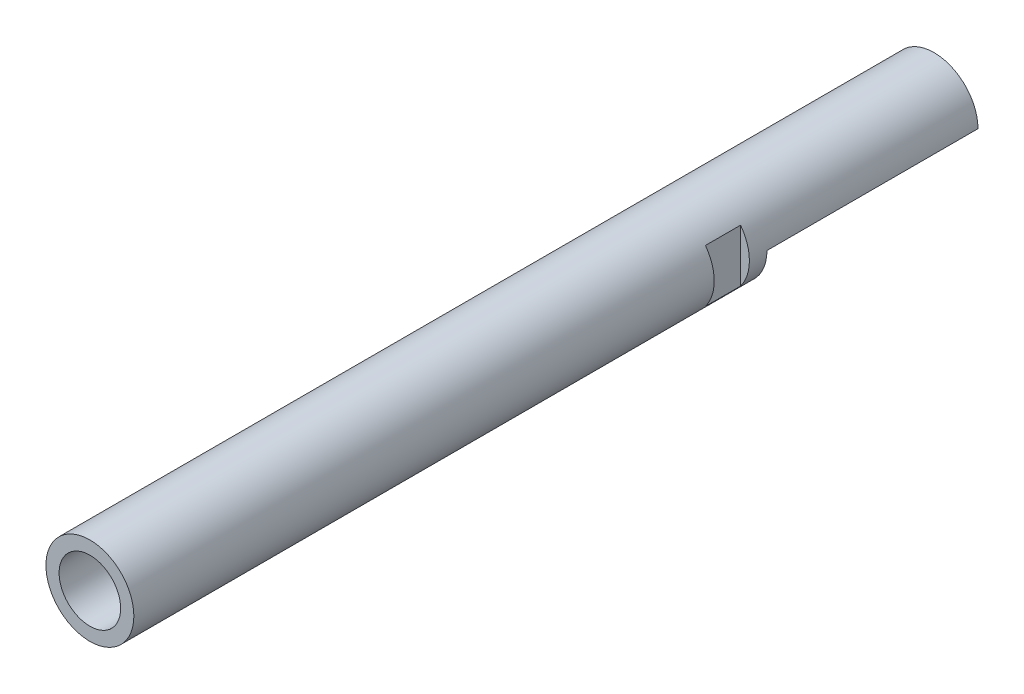
ISO-10303-21;
HEADER;
FILE_DESCRIPTION(('STEP AP214'),'2;1');
FILE_NAME('part.step','',(''),(''),'','','');
FILE_SCHEMA(('AUTOMOTIVE_DESIGN { 1 0 10303 214 1 1 1 1 }'));
ENDSEC;
DATA;
#1=APPLICATION_CONTEXT('core data for automotive mechanical design processes');
#2=APPLICATION_PROTOCOL_DEFINITION('international standard','automotive_design',2000,#1);
#3=PRODUCT_CONTEXT('',#1,'mechanical');
#4=PRODUCT('Part','Part','',(#3));
#5=PRODUCT_RELATED_PRODUCT_CATEGORY('part','',(#4));
#6=PRODUCT_DEFINITION_FORMATION('','',#4);
#7=PRODUCT_DEFINITION_CONTEXT('part definition',#1,'design');
#8=PRODUCT_DEFINITION('design','',#6,#7);
#9=PRODUCT_DEFINITION_SHAPE('','',#8);
#10=(LENGTH_UNIT() NAMED_UNIT(*) SI_UNIT(.MILLI.,.METRE.));
#11=(NAMED_UNIT(*) PLANE_ANGLE_UNIT() SI_UNIT($,.RADIAN.));
#12=(NAMED_UNIT(*) SI_UNIT($,.STERADIAN.) SOLID_ANGLE_UNIT());
#13=UNCERTAINTY_MEASURE_WITH_UNIT(LENGTH_MEASURE(1.E-05),#10,'distance_accuracy_value','');
#14=(GEOMETRIC_REPRESENTATION_CONTEXT(3) GLOBAL_UNCERTAINTY_ASSIGNED_CONTEXT((#13)) GLOBAL_UNIT_ASSIGNED_CONTEXT((#10,
#11,#12)) REPRESENTATION_CONTEXT('',''));
#15=CARTESIAN_POINT('',(0.,0.,0.));
#16=DIRECTION('',(0.,0.,1.));
#17=DIRECTION('',(1.,0.,0.));
#18=AXIS2_PLACEMENT_3D('',#15,#16,#17);
#19=CARTESIAN_POINT('',(0.,0.,304.8));
#20=DIRECTION('',(0.,0.,-1.));
#21=DIRECTION('',(-1.,0.,0.));
#22=AXIS2_PLACEMENT_3D('',#19,#20,#21);
#23=CYLINDRICAL_SURFACE('',#22,15.875);
#24=CARTESIAN_POINT('',(0.,0.,95.25));
#25=DIRECTION('',(0.,0.,-1.));
#26=DIRECTION('',(-1.,0.,0.));
#27=AXIS2_PLACEMENT_3D('',#24,#25,#26);
#28=CIRCLE('',#27,15.875);
#29=CARTESIAN_POINT('',(12.7,9.52499999999999,95.25));
#30=VERTEX_POINT('',#29);
#31=CARTESIAN_POINT('',(12.7,-9.525,95.25));
#32=VERTEX_POINT('',#31);
#33=EDGE_CURVE('E150',#30,#32,#28,.T.);
#34=ORIENTED_EDGE('',*,*,#33,.F.);
#35=DIRECTION('',(0.,0.,-1.));
#36=VECTOR('',#35,1.);
#37=CARTESIAN_POINT('',(12.7,9.52499999999999,95.25));
#38=LINE('',#37,#36);
#39=CARTESIAN_POINT('',(12.7,9.52499999999999,82.55));
#40=VERTEX_POINT('',#39);
#41=EDGE_CURVE('E155',#30,#40,#38,.T.);
#42=ORIENTED_EDGE('',*,*,#41,.T.);
#43=CARTESIAN_POINT('',(0.,0.,82.55));
#44=DIRECTION('',(0.,0.,-1.));
#45=DIRECTION('',(-1.,0.,0.));
#46=AXIS2_PLACEMENT_3D('',#43,#44,#45);
#47=CIRCLE('',#46,15.875);
#48=CARTESIAN_POINT('',(12.7,-9.525,82.55));
#49=VERTEX_POINT('',#48);
#50=EDGE_CURVE('E151',#40,#49,#47,.T.);
#51=ORIENTED_EDGE('',*,*,#50,.T.);
#52=DIRECTION('',(0.,0.,-1.));
#53=VECTOR('',#52,1.);
#54=CARTESIAN_POINT('',(12.7,-9.525,95.25));
#55=LINE('',#54,#53);
#56=EDGE_CURVE('E142',#32,#49,#55,.T.);
#57=ORIENTED_EDGE('',*,*,#56,.F.);
#58=EDGE_LOOP('',(#34,#42,#51,#57));
#59=FACE_BOUND('',#58,.T.);
#60=CARTESIAN_POINT('',(0.,0.,304.8));
#61=DIRECTION('',(0.,0.,1.));
#62=DIRECTION('',(1.,0.,0.));
#63=AXIS2_PLACEMENT_3D('',#60,#61,#62);
#64=CIRCLE('',#63,15.875);
#65=CARTESIAN_POINT('',(15.875,0.,304.8));
#66=VERTEX_POINT('',#65);
#67=EDGE_CURVE('E11',#66,#66,#64,.T.);
#68=ORIENTED_EDGE('',*,*,#67,.F.);
#69=EDGE_LOOP('',(#68));
#70=FACE_BOUND('',#69,.T.);
#71=CARTESIAN_POINT('',(0.,0.,76.2));
#72=DIRECTION('',(0.,0.,-1.));
#73=DIRECTION('',(-1.,0.,0.));
#74=AXIS2_PLACEMENT_3D('',#71,#72,#73);
#75=CIRCLE('',#74,15.875);
#76=CARTESIAN_POINT('',(15.875,0.,76.2));
#77=VERTEX_POINT('',#76);
#78=CARTESIAN_POINT('',(-15.875,0.,76.2));
#79=VERTEX_POINT('',#78);
#80=EDGE_CURVE('E167',#77,#79,#75,.T.);
#81=ORIENTED_EDGE('',*,*,#80,.F.);
#82=DIRECTION('',(0.,0.,-1.));
#83=VECTOR('',#82,1.);
#84=CARTESIAN_POINT('',(15.875,0.,76.2));
#85=LINE('',#84,#83);
#86=CARTESIAN_POINT('',(15.875,0.,0.));
#87=VERTEX_POINT('',#86);
#88=EDGE_CURVE('E178',#77,#87,#85,.T.);
#89=ORIENTED_EDGE('',*,*,#88,.T.);
#90=CARTESIAN_POINT('',(0.,0.,0.));
#91=DIRECTION('',(0.,0.,1.));
#92=DIRECTION('',(1.,0.,0.));
#93=AXIS2_PLACEMENT_3D('',#90,#91,#92);
#94=CIRCLE('',#93,15.875);
#95=CARTESIAN_POINT('',(-15.875,0.,0.));
#96=VERTEX_POINT('',#95);
#97=EDGE_CURVE('E48',#87,#96,#94,.T.);
#98=ORIENTED_EDGE('',*,*,#97,.T.);
#99=DIRECTION('',(0.,0.,-1.));
#100=VECTOR('',#99,1.);
#101=CARTESIAN_POINT('',(-15.875,0.,76.2));
#102=LINE('',#101,#100);
#103=EDGE_CURVE('E176',#79,#96,#102,.T.);
#104=ORIENTED_EDGE('',*,*,#103,.F.);
#105=EDGE_LOOP('',(#81,#89,#98,#104));
#106=FACE_BOUND('',#105,.T.);
#107=CARTESIAN_POINT('',(0.,0.,95.25));
#108=DIRECTION('',(0.,0.,-1.));
#109=DIRECTION('',(-1.,0.,0.));
#110=AXIS2_PLACEMENT_3D('',#107,#108,#109);
#111=CIRCLE('',#110,15.875);
#112=CARTESIAN_POINT('',(9.52499999999999,-12.7,95.25));
#113=VERTEX_POINT('',#112);
#114=CARTESIAN_POINT('',(-9.52499999999999,-12.7,95.25));
#115=VERTEX_POINT('',#114);
#116=EDGE_CURVE('E126',#113,#115,#111,.T.);
#117=ORIENTED_EDGE('',*,*,#116,.F.);
#118=DIRECTION('',(0.,0.,-1.));
#119=VECTOR('',#118,1.);
#120=CARTESIAN_POINT('',(9.52499999999999,-12.7,95.25));
#121=LINE('',#120,#119);
#122=CARTESIAN_POINT('',(9.52499999999999,-12.7,82.55));
#123=VERTEX_POINT('',#122);
#124=EDGE_CURVE('E116',#113,#123,#121,.T.);
#125=ORIENTED_EDGE('',*,*,#124,.T.);
#126=CARTESIAN_POINT('',(0.,0.,82.55));
#127=DIRECTION('',(0.,0.,-1.));
#128=DIRECTION('',(-1.,0.,0.));
#129=AXIS2_PLACEMENT_3D('',#126,#127,#128);
#130=CIRCLE('',#129,15.875);
#131=CARTESIAN_POINT('',(-9.52499999999999,-12.7,82.55));
#132=VERTEX_POINT('',#131);
#133=EDGE_CURVE('E132',#123,#132,#130,.T.);
#134=ORIENTED_EDGE('',*,*,#133,.T.);
#135=DIRECTION('',(0.,0.,-1.));
#136=VECTOR('',#135,1.);
#137=CARTESIAN_POINT('',(-9.52499999999999,-12.7,95.25));
#138=LINE('',#137,#136);
#139=EDGE_CURVE('E125',#115,#132,#138,.T.);
#140=ORIENTED_EDGE('',*,*,#139,.F.);
#141=EDGE_LOOP('',(#117,#125,#134,#140));
#142=FACE_BOUND('',#141,.T.);
#143=CARTESIAN_POINT('',(-3.175,-15.5542598666732,171.45));
#144=CARTESIAN_POINT('',(-3.17499347815399,-15.554263374096,171.626416892184));
#145=CARTESIAN_POINT('',(-3.16024632020511,-15.5572938875313,171.802915929083));
#146=CARTESIAN_POINT('',(-3.10169650037552,-15.5690706939298,172.150920953829));
#147=CARTESIAN_POINT('',(-3.05787058944881,-15.577821560347,172.322422831719));
#148=CARTESIAN_POINT('',(-2.94257660981768,-15.6000092406689,172.65534843815));
#149=CARTESIAN_POINT('',(-2.87113603493456,-15.6134413924691,172.816782005866));
#150=CARTESIAN_POINT('',(-2.70271591685384,-15.6434726335109,173.125367631913));
#151=CARTESIAN_POINT('',(-2.60573779905864,-15.6600715459824,173.272520486708));
#152=CARTESIAN_POINT('',(-2.38753356519964,-15.6948282652925,173.550456187236));
#153=CARTESIAN_POINT('',(-2.26601545752475,-15.7130031763326,173.681007691532));
#154=CARTESIAN_POINT('',(-2.00281155514263,-15.7487134956075,173.920015169113));
#155=CARTESIAN_POINT('',(-1.86112434790507,-15.7662488589439,174.02846959355));
#156=CARTESIAN_POINT('',(-1.56007230505949,-15.7988887862576,174.22110195597));
#157=CARTESIAN_POINT('',(-1.40056415235925,-15.8139708307692,174.305060056368));
#158=CARTESIAN_POINT('',(-1.06935317747957,-15.8398126460553,174.444897925128));
#159=CARTESIAN_POINT('',(-0.897651498510246,-15.8505728214008,174.500780321786));
#160=CARTESIAN_POINT('',(-0.549328255159211,-15.8664376818573,174.582160339742));
#161=CARTESIAN_POINT('',(-0.372801322007024,-15.871615014648,174.608048603788));
#162=CARTESIAN_POINT('',(-0.0178389547891655,-15.8759817475794,174.629924272087));
#163=CARTESIAN_POINT('',(0.160596293716114,-15.8751717247251,174.625914557625));
#164=CARTESIAN_POINT('',(0.511625852360906,-15.8677113070754,174.588404377816));
#165=CARTESIAN_POINT('',(0.684267155397654,-15.8611442481154,174.555324697492));
#166=CARTESIAN_POINT('',(1.02149791439247,-15.8430016248112,174.461281021943));
#167=CARTESIAN_POINT('',(1.18608704789715,-15.8314258600732,174.400315911041));
#168=CARTESIAN_POINT('',(1.50374179566283,-15.8044291486337,174.251842122532));
#169=CARTESIAN_POINT('',(1.65672825287515,-15.7889844295633,174.164168590242));
#170=CARTESIAN_POINT('',(1.94597352060474,-15.7559524057927,173.964888679774));
#171=CARTESIAN_POINT('',(2.08223040349189,-15.7383648546533,173.853279547729));
#172=CARTESIAN_POINT('',(2.33664579359473,-15.7026281185716,173.606988249806));
#173=CARTESIAN_POINT('',(2.45444745512127,-15.6844744875261,173.471937832134));
#174=CARTESIAN_POINT('',(2.66578871583636,-15.6499423982607,173.183815295219));
#175=CARTESIAN_POINT('',(2.75932785613561,-15.6335639736194,173.030742835196));
#176=CARTESIAN_POINT('',(2.91961193699597,-15.6044280072653,172.710408858966));
#177=CARTESIAN_POINT('',(2.98629910669422,-15.5916782896427,172.543117677744));
#178=CARTESIAN_POINT('',(3.09051433466756,-15.5713581232004,172.199391047176));
#179=CARTESIAN_POINT('',(3.12804619327484,-15.5637869993776,172.022956792809));
#180=CARTESIAN_POINT('',(3.17235206916446,-15.5548164667535,171.669186575853));
#181=CARTESIAN_POINT('',(3.17964140200086,-15.5533136690647,171.491917701565));
#182=CARTESIAN_POINT('',(3.16464196988659,-15.5563724206211,171.138696891341));
#183=CARTESIAN_POINT('',(3.14235488216375,-15.5609336259873,170.962744881298));
#184=CARTESIAN_POINT('',(3.06927951063544,-15.5755096317135,170.618884567072));
#185=CARTESIAN_POINT('',(3.01876657116477,-15.5854717187103,170.450915310861));
#186=CARTESIAN_POINT('',(2.89096778710454,-15.6096807869154,170.125824089084));
#187=CARTESIAN_POINT('',(2.81367973703483,-15.6239281210891,169.968703018367));
#188=CARTESIAN_POINT('',(2.63335815153451,-15.6553346392948,169.667513375908));
#189=CARTESIAN_POINT('',(2.53000217259522,-15.6725293567107,169.523641627995));
#190=CARTESIAN_POINT('',(2.30090844177534,-15.7077957314957,169.255096109397));
#191=CARTESIAN_POINT('',(2.17516838633388,-15.7258674789812,169.130424317059));
#192=CARTESIAN_POINT('',(1.90256246835578,-15.7611872313476,168.901863874586));
#193=CARTESIAN_POINT('',(1.75540193410156,-15.7784183322507,168.798323646486));
#194=CARTESIAN_POINT('',(1.44547557181534,-15.8098213022087,168.617436826239));
#195=CARTESIAN_POINT('',(1.28271039950137,-15.823993299728,168.54008913408));
#196=CARTESIAN_POINT('',(0.947111011616228,-15.8476090864389,168.414290832204));
#197=CARTESIAN_POINT('',(0.774340188292887,-15.8570796377776,168.365676354632));
#198=CARTESIAN_POINT('',(0.422876518608706,-15.8703402410208,168.298205288667));
#199=CARTESIAN_POINT('',(0.24418438815808,-15.8741309770952,168.279345116165));
#200=CARTESIAN_POINT('',(-0.110721438144017,-15.8755886594182,168.272056835443));
#201=CARTESIAN_POINT('',(-0.286924153549263,-15.8733610189412,168.283104884551));
#202=CARTESIAN_POINT('',(-0.634908024427208,-15.8632538830408,168.334162792989));
#203=CARTESIAN_POINT('',(-0.806689235468087,-15.8553744586832,168.374172288155));
#204=CARTESIAN_POINT('',(-1.1406274804406,-15.8348520730862,168.481784549891));
#205=CARTESIAN_POINT('',(-1.30280550728754,-15.8222199826118,168.549324375566));
#206=CARTESIAN_POINT('',(-1.61360237409078,-15.7935524274268,168.710013866226));
#207=CARTESIAN_POINT('',(-1.76222014131293,-15.7775166937919,168.803165554997));
#208=CARTESIAN_POINT('',(-2.04426785108629,-15.7434787732265,169.01420155392));
#209=CARTESIAN_POINT('',(-2.17741409866463,-15.7254490360183,169.132460618018));
#210=CARTESIAN_POINT('',(-2.42215231138326,-15.6896188273247,169.389584512314));
#211=CARTESIAN_POINT('',(-2.53373916418831,-15.6718184111493,169.528454216099));
#212=CARTESIAN_POINT('',(-2.7333327967537,-15.6382511318023,169.824651830492));
#213=CARTESIAN_POINT('',(-2.82107263641245,-15.6225082383864,169.98216245156));
#214=CARTESIAN_POINT('',(-2.96870135642028,-15.5951312787636,170.309961555101));
#215=CARTESIAN_POINT('',(-3.02861550096797,-15.5834934876682,170.480238282832));
#216=CARTESIAN_POINT('',(-3.10727451904805,-15.5679673761266,170.784083296031));
#217=CARTESIAN_POINT('',(-3.1326261278127,-15.5628589210387,170.915918706957));
#218=CARTESIAN_POINT('',(-3.16649105702208,-15.5560038910759,171.1818203057));
#219=CARTESIAN_POINT('',(-3.17500495796139,-15.5542572003013,171.315886416451));
#220=CARTESIAN_POINT('',(-3.175,-15.5542598666732,171.45));
#221=B_SPLINE_CURVE_WITH_KNOTS('',3,(#143,#144,#145,#146,#147,#148,#149,#150,#151,#152,#153,
#154,#155,#156,#157,#158,#159,#160,#161,#162,#163,#164,#165,#166,#167,#168,#169,#170,#171,#172,
#173,#174,#175,#176,#177,#178,#179,#180,#181,#182,#183,#184,#185,#186,#187,#188,#189,#190,#191,
#192,#193,#194,#195,#196,#197,#198,#199,#200,#201,#202,#203,#204,#205,#206,#207,#208,#209,#210,
#211,#212,#213,#214,#215,#216,#217,#218,#219,#220),.UNSPECIFIED.,.T.,.F.,(4,2,2,2,2,2,2,2,2,2,2,
2,2,2,2,2,2,2,2,2,2,2,2,2,2,2,2,2,2,2,2,2,2,2,2,2,2,2,4),(0.,0.528759622785412,1.05794250972765,
1.5865998809614,2.11522775093011,2.6505615184129,3.18593279612466,3.72597046388906,
4.26595756682828,4.79882990203781,5.33165088469089,5.85688407086482,6.38213827309158,
6.91070259405814,7.43932776069962,7.97716675970883,8.51501593039638,9.05401615573563,
9.59294611175879,10.1226543102958,10.6523324712774,11.1769316016204,11.7015739537522,
12.2330546478411,12.7645900686291,13.3042851050371,13.8439574730058,14.3805215811221,
14.9170210514592,15.4441848029163,15.9713419258945,16.4973005421456,17.0233007302762,
17.5577865768127,18.0923990097506,18.6327700299025,19.1726494591138,19.5746307655116,
19.976598213014),.UNSPECIFIED.);
#222=CARTESIAN_POINT('',(-3.175,-15.5542598666732,171.45));
#223=VERTEX_POINT('',#222);
#224=EDGE_CURVE('E158',#223,#223,#221,.T.);
#225=ORIENTED_EDGE('',*,*,#224,.T.);
#226=EDGE_LOOP('',(#225));
#227=FACE_BOUND('',#226,.T.);
#228=ADVANCED_FACE('F39',(#59,#70,#106,#142,#227),#23,.T.);
#229=CARTESIAN_POINT('',(0.,0.,304.8));
#230=DIRECTION('',(0.,0.,-1.));
#231=DIRECTION('',(-1.,0.,0.));
#232=AXIS2_PLACEMENT_3D('',#229,#230,#231);
#233=CYLINDRICAL_SURFACE('',#232,9.525);
#234=CARTESIAN_POINT('',(0.,0.,285.75));
#235=DIRECTION('',(0.,0.,1.));
#236=DIRECTION('',(1.,0.,0.));
#237=AXIS2_PLACEMENT_3D('',#234,#235,#236);
#238=CIRCLE('',#237,9.525);
#239=CARTESIAN_POINT('',(9.525,0.,285.75));
#240=VERTEX_POINT('',#239);
#241=EDGE_CURVE('E42',#240,#240,#238,.T.);
#242=ORIENTED_EDGE('',*,*,#241,.T.);
#243=EDGE_LOOP('',(#242));
#244=FACE_BOUND('',#243,.T.);
#245=DIRECTION('',(0.,0.,-1.));
#246=VECTOR('',#245,1.);
#247=CARTESIAN_POINT('',(9.525,0.,304.8));
#248=LINE('',#247,#246);
#249=CARTESIAN_POINT('',(9.525,0.,76.2));
#250=VERTEX_POINT('',#249);
#251=CARTESIAN_POINT('',(9.525,0.,0.));
#252=VERTEX_POINT('',#251);
#253=EDGE_CURVE('E191',#250,#252,#248,.T.);
#254=ORIENTED_EDGE('',*,*,#253,.F.);
#255=CARTESIAN_POINT('',(0.,0.,76.2));
#256=DIRECTION('',(0.,0.,-1.));
#257=DIRECTION('',(-1.,0.,0.));
#258=AXIS2_PLACEMENT_3D('',#255,#256,#257);
#259=CIRCLE('',#258,9.525);
#260=CARTESIAN_POINT('',(-9.525,0.,76.2));
#261=VERTEX_POINT('',#260);
#262=EDGE_CURVE('E182',#250,#261,#259,.T.);
#263=ORIENTED_EDGE('',*,*,#262,.T.);
#264=DIRECTION('',(0.,0.,-1.));
#265=VECTOR('',#264,1.);
#266=CARTESIAN_POINT('',(-9.525,0.,304.8));
#267=LINE('',#266,#265);
#268=CARTESIAN_POINT('',(-9.525,0.,0.));
#269=VERTEX_POINT('',#268);
#270=EDGE_CURVE('E188',#269,#261,#267,.F.);
#271=ORIENTED_EDGE('',*,*,#270,.F.);
#272=CARTESIAN_POINT('',(0.,0.,0.));
#273=DIRECTION('',(0.,0.,1.));
#274=DIRECTION('',(1.,0.,0.));
#275=AXIS2_PLACEMENT_3D('',#272,#273,#274);
#276=CIRCLE('',#275,9.525);
#277=EDGE_CURVE('E202',#252,#269,#276,.T.);
#278=ORIENTED_EDGE('',*,*,#277,.F.);
#279=EDGE_LOOP('',(#254,#263,#271,#278));
#280=FACE_BOUND('',#279,.T.);
#281=CARTESIAN_POINT('',(3.175,-8.98025612106916,171.45));
#282=CARTESIAN_POINT('',(3.17500081898398,-8.98025555134128,171.622936455105));
#283=CARTESIAN_POINT('',(3.16082293820153,-8.98530617498472,171.79586798944));
#284=CARTESIAN_POINT('',(3.10467734311197,-9.00485797707984,172.136607786657));
#285=CARTESIAN_POINT('',(3.06270505113466,-9.01936071226449,172.304415200845));
#286=CARTESIAN_POINT('',(2.95260866704957,-9.05599546711914,172.629915385266));
#287=CARTESIAN_POINT('',(2.8845358279553,-9.07811252608947,172.787627275981));
#288=CARTESIAN_POINT('',(2.72434567030138,-9.12746212382781,173.08944315414));
#289=CARTESIAN_POINT('',(2.63222304663107,-9.15469579088969,173.233544129608));
#290=CARTESIAN_POINT('',(2.42268738995613,-9.21240503868728,173.509685880424));
#291=CARTESIAN_POINT('',(2.30449228387489,-9.24296141131745,173.641116486033));
#292=CARTESIAN_POINT('',(2.04783584340569,-9.30319020743185,173.882706593888));
#293=CARTESIAN_POINT('',(1.90937126079128,-9.33286248831953,173.992862680274));
#294=CARTESIAN_POINT('',(1.61164431278889,-9.38891527476712,174.191545499021));
#295=CARTESIAN_POINT('',(1.45193356813785,-9.41518969452598,174.279432906712));
#296=CARTESIAN_POINT('',(1.11896913298521,-9.46053437997871,174.42685328278));
#297=CARTESIAN_POINT('',(0.945719107056873,-9.47960658694532,174.486393892837));
#298=CARTESIAN_POINT('',(0.596991495351314,-9.50782564496304,174.573361338458));
#299=CARTESIAN_POINT('',(0.421801146658145,-9.5172947441875,174.601833441866));
#300=CARTESIAN_POINT('',(0.0688907525664566,-9.52638456092937,174.62917923142));
#301=CARTESIAN_POINT('',(-0.108828629001897,-9.52600781684693,174.628060546496));
#302=CARTESIAN_POINT('',(-0.454353660740386,-9.51566675789472,174.596919491753));
#303=CARTESIAN_POINT('',(-0.622274754278533,-9.50607905597498,174.568032472093));
#304=CARTESIAN_POINT('',(-0.950732918260417,-9.47886621303647,174.484052285387));
#305=CARTESIAN_POINT('',(-1.11126948744903,-9.46124052729002,174.428957342239));
#306=CARTESIAN_POINT('',(-1.42288410762328,-9.41945253180987,174.293462317553));
#307=CARTESIAN_POINT('',(-1.5738101015761,-9.39520735013749,174.212739145115));
#308=CARTESIAN_POINT('',(-1.86030973354926,-9.34270397898568,174.0285454352));
#309=CARTESIAN_POINT('',(-1.99587908667347,-9.31444467439657,173.925068572435));
#310=CARTESIAN_POINT('',(-2.25457025130042,-9.25532159123421,173.692583800765));
#311=CARTESIAN_POINT('',(-2.37680549868225,-9.22439783161187,173.562603223853));
#312=CARTESIAN_POINT('',(-2.59803029922421,-9.1645528941526,173.283725295818));
#313=CARTESIAN_POINT('',(-2.69701626991891,-9.13563202542328,173.134825034813));
#314=CARTESIAN_POINT('',(-2.8701601697385,-9.08273917259531,172.819524738709));
#315=CARTESIAN_POINT('',(-2.94394402199776,-9.05884361979074,172.652905483066));
#316=CARTESIAN_POINT('',(-3.06210713863015,-9.01959241367422,172.308610823369));
#317=CARTESIAN_POINT('',(-3.10649872649829,-9.00423318171519,172.13094008717));
#318=CARTESIAN_POINT('',(-3.16281207065963,-8.98460345301983,171.778173221568));
#319=CARTESIAN_POINT('',(-3.17610837823673,-8.9798639401205,171.603322576423));
#320=CARTESIAN_POINT('',(-3.17374726853836,-8.9806993378791,171.253860726563));
#321=CARTESIAN_POINT('',(-3.15809511009497,-8.98627237514011,171.079249484124));
#322=CARTESIAN_POINT('',(-3.09951644367858,-9.00663737436701,170.741476633865));
#323=CARTESIAN_POINT('',(-3.05754530088867,-9.02110608274668,170.578127759271));
#324=CARTESIAN_POINT('',(-2.94866651362948,-9.05727657905498,170.260824050191));
#325=CARTESIAN_POINT('',(-2.88175444845385,-9.07897964918116,170.106870886699));
#326=CARTESIAN_POINT('',(-2.72248103184611,-9.12802586366624,169.807317163811));
#327=CARTESIAN_POINT('',(-2.62937980078821,-9.1555260648837,169.662136409612));
#328=CARTESIAN_POINT('',(-2.42120937702024,-9.21276315720815,169.388961283682));
#329=CARTESIAN_POINT('',(-2.30613370845863,-9.24250070609047,169.260971997251));
#330=CARTESIAN_POINT('',(-2.05070616623353,-9.30259247675171,169.019448650512));
#331=CARTESIAN_POINT('',(-1.90940458398562,-9.33290753359822,168.90690631169));
#332=CARTESIAN_POINT('',(-1.60917665019581,-9.38932753871621,168.707066248045));
#333=CARTESIAN_POINT('',(-1.45025092494494,-9.41543263651181,168.619767626559));
#334=CARTESIAN_POINT('',(-1.12007606322253,-9.46036988448665,168.473691167064));
#335=CARTESIAN_POINT('',(-0.948915816544785,-9.47924920264386,168.414727695055));
#336=CARTESIAN_POINT('',(-0.598355629061084,-9.50781089409934,168.326664418959));
#337=CARTESIAN_POINT('',(-0.418958686953579,-9.5174965870801,168.297553835129));
#338=CARTESIAN_POINT('',(-0.0660886913556095,-9.52632915775114,168.270992903602));
#339=CARTESIAN_POINT('',(0.107266498446077,-9.52594996283969,168.272118833765));
#340=CARTESIAN_POINT('',(0.451202885375569,-9.51586223949089,168.302486953365));
#341=CARTESIAN_POINT('',(0.621784306400522,-9.50615446789103,168.331726861885));
#342=CARTESIAN_POINT('',(0.952633729196801,-9.47867404980259,168.416548594779));
#343=CARTESIAN_POINT('',(1.11302251014812,-9.46103195296647,168.471704633746));
#344=CARTESIAN_POINT('',(1.42233126423386,-9.41949985236771,168.606398661233));
#345=CARTESIAN_POINT('',(1.57124915665223,-9.39560871852452,168.685941060251));
#346=CARTESIAN_POINT('',(1.8593880017804,-9.34294133528522,168.870533200924));
#347=CARTESIAN_POINT('',(1.99804734869541,-9.31401720161867,168.976416826087));
#348=CARTESIAN_POINT('',(2.25609475841496,-9.25490239414218,169.209267216921));
#349=CARTESIAN_POINT('',(2.37547664865808,-9.22471131854584,169.336240709184));
#350=CARTESIAN_POINT('',(2.59633024304515,-9.16505913446274,169.613609703989));
#351=CARTESIAN_POINT('',(2.69691791704333,-9.13567286363902,169.764727497351));
#352=CARTESIAN_POINT('',(2.87119803998104,-9.08241113800574,170.082636805416));
#353=CARTESIAN_POINT('',(2.94489751640183,-9.05853424386967,170.249424210369));
#354=CARTESIAN_POINT('',(3.06020415454822,-9.02021736105684,170.58627879125));
#355=CARTESIAN_POINT('',(3.10311136154972,-9.00539959321554,170.755856936693));
#356=CARTESIAN_POINT('',(3.16050396647392,-8.9854209273797,171.100292960232));
#357=CARTESIAN_POINT('',(3.17499917194918,-8.98025669710439,171.275148995279));
#358=CARTESIAN_POINT('',(3.175,-8.98025612106916,171.45));
#359=B_SPLINE_CURVE_WITH_KNOTS('',3,(#281,#282,#283,#284,#285,#286,#287,#288,#289,#290,#291,
#292,#293,#294,#295,#296,#297,#298,#299,#300,#301,#302,#303,#304,#305,#306,#307,#308,#309,#310,
#311,#312,#313,#314,#315,#316,#317,#318,#319,#320,#321,#322,#323,#324,#325,#326,#327,#328,#329,
#330,#331,#332,#333,#334,#335,#336,#337,#338,#339,#340,#341,#342,#343,#344,#345,#346,#347,#348,
#349,#350,#351,#352,#353,#354,#355,#356,#357,#358),.UNSPECIFIED.,.T.,.F.,(4,2,2,2,2,2,2,2,2,2,2,
2,2,2,2,2,2,2,2,2,2,2,2,2,2,2,2,2,2,2,2,2,2,2,2,2,2,2,4),(0.,0.518161856737926,1.03640907467316,
1.55364379231514,2.07099270263877,2.60671746332529,3.14252816921063,3.69231882006113,
4.24196117528058,4.77247962078669,5.30286129234891,5.81244090321183,6.32205505300828,
6.83836754181565,7.35482374200021,7.89559553605441,8.43645060268438,8.98501631501702,
9.53335188057253,10.0569487508209,10.5804505128322,11.0859695656586,11.5915782629155,
12.113223733109,12.6350231697725,13.1819271594322,13.7288117205516,14.2720628703095,
14.815117785382,15.3326491885149,15.8501386073106,16.3594083542837,16.868770261733,
17.3969527447801,17.9253040157361,18.4743376618725,19.023227709973,19.5473069861654,
20.0712053232972),.UNSPECIFIED.);
#360=CARTESIAN_POINT('',(3.175,-8.98025612106916,171.45));
#361=VERTEX_POINT('',#360);
#362=EDGE_CURVE('E234',#361,#361,#359,.T.);
#363=ORIENTED_EDGE('',*,*,#362,.T.);
#364=EDGE_LOOP('',(#363));
#365=FACE_BOUND('',#364,.T.);
#366=ADVANCED_FACE('F220',(#244,#280,#365),#233,.F.);
#367=CARTESIAN_POINT('',(0.,0.,304.8));
#368=DIRECTION('',(0.,0.,1.));
#369=DIRECTION('',(1.,0.,0.));
#370=AXIS2_PLACEMENT_3D('',#367,#368,#369);
#371=PLANE('',#370);
#372=CARTESIAN_POINT('',(0.,0.,304.8));
#373=DIRECTION('',(0.,0.,1.));
#374=DIRECTION('',(1.,0.,0.));
#375=AXIS2_PLACEMENT_3D('',#372,#373,#374);
#376=CIRCLE('',#375,11.1125);
#377=CARTESIAN_POINT('',(11.1125,0.,304.8));
#378=VERTEX_POINT('',#377);
#379=EDGE_CURVE('E194',#378,#378,#376,.T.);
#380=ORIENTED_EDGE('',*,*,#379,.F.);
#381=EDGE_LOOP('',(#380));
#382=FACE_BOUND('',#381,.T.);
#383=ORIENTED_EDGE('',*,*,#67,.T.);
#384=EDGE_LOOP('',(#383));
#385=FACE_BOUND('',#384,.T.);
#386=ADVANCED_FACE('F286',(#382,#385),#371,.T.);
#387=CARTESIAN_POINT('',(0.,0.,0.));
#388=DIRECTION('',(0.,0.,1.));
#389=DIRECTION('',(1.,0.,0.));
#390=AXIS2_PLACEMENT_3D('',#387,#388,#389);
#391=PLANE('',#390);
#392=ORIENTED_EDGE('',*,*,#97,.F.);
#393=DIRECTION('',(1.,0.,0.));
#394=VECTOR('',#393,1.);
#395=CARTESIAN_POINT('',(-15.875,0.,0.));
#396=LINE('',#395,#394);
#397=EDGE_CURVE('E145',#252,#87,#396,.T.);
#398=ORIENTED_EDGE('',*,*,#397,.F.);
#399=ORIENTED_EDGE('',*,*,#277,.T.);
#400=EDGE_CURVE('E171',#96,#269,#396,.T.);
#401=ORIENTED_EDGE('',*,*,#400,.F.);
#402=EDGE_LOOP('',(#392,#398,#399,#401));
#403=FACE_BOUND('',#402,.T.);
#404=ADVANCED_FACE('F212',(#403),#391,.F.);
#405=CARTESIAN_POINT('',(0.,0.,285.75));
#406=DIRECTION('',(0.,0.,1.));
#407=DIRECTION('',(1.,0.,0.));
#408=AXIS2_PLACEMENT_3D('',#405,#406,#407);
#409=CYLINDRICAL_SURFACE('',#408,11.1125);
#410=CARTESIAN_POINT('',(0.,0.,285.75));
#411=DIRECTION('',(0.,0.,1.));
#412=DIRECTION('',(1.,0.,0.));
#413=AXIS2_PLACEMENT_3D('',#410,#411,#412);
#414=CIRCLE('',#413,11.1125);
#415=CARTESIAN_POINT('',(11.1125,0.,285.75));
#416=VERTEX_POINT('',#415);
#417=EDGE_CURVE('E195',#416,#416,#414,.T.);
#418=CARTESIAN_POINT('',(11.1125,0.,285.75));
#419=CARTESIAN_POINT('',(11.1125,0.,285.9484375));
#420=CARTESIAN_POINT('',(11.1125,0.,286.146875));
#421=CARTESIAN_POINT('',(11.1125,0.,286.54375));
#422=CARTESIAN_POINT('',(11.1125,0.,286.7421875));
#423=CARTESIAN_POINT('',(11.1125,0.,287.1390625));
#424=CARTESIAN_POINT('',(11.1125,0.,287.3375));
#425=CARTESIAN_POINT('',(11.1125,0.,287.734375));
#426=CARTESIAN_POINT('',(11.1125,0.,287.9328125));
#427=CARTESIAN_POINT('',(11.1125,0.,288.3296875));
#428=CARTESIAN_POINT('',(11.1125,0.,288.528125));
#429=CARTESIAN_POINT('',(11.1125,0.,288.925));
#430=CARTESIAN_POINT('',(11.1125,0.,289.1234375));
#431=CARTESIAN_POINT('',(11.1125,0.,289.5203125));
#432=CARTESIAN_POINT('',(11.1125,0.,289.71875));
#433=CARTESIAN_POINT('',(11.1125,0.,290.115625));
#434=CARTESIAN_POINT('',(11.1125,0.,290.3140625));
#435=CARTESIAN_POINT('',(11.1125,0.,290.7109375));
#436=CARTESIAN_POINT('',(11.1125,0.,290.909375));
#437=CARTESIAN_POINT('',(11.1125,0.,291.30625));
#438=CARTESIAN_POINT('',(11.1125,0.,291.5046875));
#439=CARTESIAN_POINT('',(11.1125,0.,291.9015625));
#440=CARTESIAN_POINT('',(11.1125,0.,292.1));
#441=CARTESIAN_POINT('',(11.1125,0.,292.496875));
#442=CARTESIAN_POINT('',(11.1125,0.,292.6953125));
#443=CARTESIAN_POINT('',(11.1125,0.,293.0921875));
#444=CARTESIAN_POINT('',(11.1125,0.,293.290625));
#445=CARTESIAN_POINT('',(11.1125,0.,293.6875));
#446=CARTESIAN_POINT('',(11.1125,0.,293.8859375));
#447=CARTESIAN_POINT('',(11.1125,0.,294.2828125));
#448=CARTESIAN_POINT('',(11.1125,0.,294.48125));
#449=CARTESIAN_POINT('',(11.1125,0.,294.878125));
#450=CARTESIAN_POINT('',(11.1125,0.,295.0765625));
#451=CARTESIAN_POINT('',(11.1125,0.,295.4734375));
#452=CARTESIAN_POINT('',(11.1125,0.,295.671875));
#453=CARTESIAN_POINT('',(11.1125,0.,296.06875));
#454=CARTESIAN_POINT('',(11.1125,0.,296.2671875));
#455=CARTESIAN_POINT('',(11.1125,0.,296.6640625));
#456=CARTESIAN_POINT('',(11.1125,0.,296.8625));
#457=CARTESIAN_POINT('',(11.1125,0.,297.259375));
#458=CARTESIAN_POINT('',(11.1125,0.,297.4578125));
#459=CARTESIAN_POINT('',(11.1125,0.,297.8546875));
#460=CARTESIAN_POINT('',(11.1125,0.,298.053125));
#461=CARTESIAN_POINT('',(11.1125,0.,298.45));
#462=CARTESIAN_POINT('',(11.1125,0.,298.6484375));
#463=CARTESIAN_POINT('',(11.1125,0.,299.0453125));
#464=CARTESIAN_POINT('',(11.1125,0.,299.24375));
#465=CARTESIAN_POINT('',(11.1125,0.,299.640625));
#466=CARTESIAN_POINT('',(11.1125,0.,299.8390625));
#467=CARTESIAN_POINT('',(11.1125,0.,300.2359375));
#468=CARTESIAN_POINT('',(11.1125,0.,300.434375));
#469=CARTESIAN_POINT('',(11.1125,0.,300.83125));
#470=CARTESIAN_POINT('',(11.1125,0.,301.0296875));
#471=CARTESIAN_POINT('',(11.1125,0.,301.4265625));
#472=CARTESIAN_POINT('',(11.1125,0.,301.625));
#473=CARTESIAN_POINT('',(11.1125,0.,302.021875));
#474=CARTESIAN_POINT('',(11.1125,0.,302.2203125));
#475=CARTESIAN_POINT('',(11.1125,0.,302.6171875));
#476=CARTESIAN_POINT('',(11.1125,0.,302.815625));
#477=CARTESIAN_POINT('',(11.1125,0.,303.2125));
#478=CARTESIAN_POINT('',(11.1125,0.,303.4109375));
#479=CARTESIAN_POINT('',(11.1125,0.,303.8078125));
#480=CARTESIAN_POINT('',(11.1125,0.,304.00625));
#481=CARTESIAN_POINT('',(11.1125,0.,304.403125));
#482=CARTESIAN_POINT('',(11.1125,0.,304.6015625));
#483=CARTESIAN_POINT('',(11.1125,0.,304.8));
#484=B_SPLINE_CURVE_WITH_KNOTS('',3,(#418,#419,#420,#421,#422,#423,#424,#425,#426,#427,#428,
#429,#430,#431,#432,#433,#434,#435,#436,#437,#438,#439,#440,#441,#442,#443,#444,#445,#446,#447,
#448,#449,#450,#451,#452,#453,#454,#455,#456,#457,#458,#459,#460,#461,#462,#463,#464,#465,#466,
#467,#468,#469,#470,#471,#472,#473,#474,#475,#476,#477,#478,#479,#480,#481,#482,#483),
.UNSPECIFIED.,.F.,.F.,(4,2,2,2,2,2,2,2,2,2,2,2,2,2,2,2,2,2,2,2,2,2,2,2,2,2,2,2,2,2,2,2,4),(0.,
0.5953125,1.190625,1.7859375,2.38125,2.9765625,3.571875,4.1671875,4.7625,5.3578125,5.953125,
6.5484375,7.14375,7.7390625,8.334375,8.92968750000001,9.52500000000001,10.1203125,10.715625,
11.3109375,11.90625,12.5015625,13.096875,13.6921875,14.2875,14.8828125,15.478125,16.0734375,
16.66875,17.2640625,17.859375,18.4546875,19.05),.UNSPECIFIED.);
#485=EDGE_CURVE('BSEAM279',#416,#378,#484,.T.);
#486=ORIENTED_EDGE('',*,*,#417,.F.);
#487=ORIENTED_EDGE('',*,*,#379,.T.);
#488=ORIENTED_EDGE('',*,*,#485,.T.);
#489=ORIENTED_EDGE('',*,*,#485,.F.);
#490=EDGE_LOOP('',(#486,#488,#487,#489));
#491=FACE_BOUND('',#490,.T.);
#492=ADVANCED_FACE('F279',(#491),#409,.F.);
#493=CARTESIAN_POINT('',(0.,0.,285.75));
#494=DIRECTION('',(0.,0.,1.));
#495=DIRECTION('',(1.,0.,0.));
#496=AXIS2_PLACEMENT_3D('',#493,#494,#495);
#497=PLANE('',#496);
#498=ORIENTED_EDGE('',*,*,#241,.F.);
#499=EDGE_LOOP('',(#498));
#500=FACE_BOUND('',#499,.T.);
#501=ORIENTED_EDGE('',*,*,#417,.T.);
#502=EDGE_LOOP('',(#501));
#503=FACE_BOUND('',#502,.T.);
#504=ADVANCED_FACE('F276',(#500,#503),#497,.T.);
#505=CARTESIAN_POINT('',(-15.875,0.,76.2));
#506=DIRECTION('',(0.,1.,0.));
#507=DIRECTION('',(0.,0.,1.));
#508=AXIS2_PLACEMENT_3D('',#505,#506,#507);
#509=PLANE('',#508);
#510=ORIENTED_EDGE('',*,*,#253,.T.);
#511=ORIENTED_EDGE('',*,*,#397,.T.);
#512=ORIENTED_EDGE('',*,*,#88,.F.);
#513=DIRECTION('',(1.,0.,0.));
#514=VECTOR('',#513,1.);
#515=CARTESIAN_POINT('',(-15.875,0.,76.2));
#516=LINE('',#515,#514);
#517=EDGE_CURVE('E170',#250,#77,#516,.T.);
#518=ORIENTED_EDGE('',*,*,#517,.F.);
#519=EDGE_LOOP('',(#510,#511,#512,#518));
#520=FACE_BOUND('',#519,.T.);
#521=ADVANCED_FACE('F227',(#520),#509,.F.);
#522=ORIENTED_EDGE('',*,*,#270,.T.);
#523=EDGE_CURVE('E172',#79,#261,#516,.T.);
#524=ORIENTED_EDGE('',*,*,#523,.F.);
#525=ORIENTED_EDGE('',*,*,#103,.T.);
#526=ORIENTED_EDGE('',*,*,#400,.T.);
#527=EDGE_LOOP('',(#522,#524,#525,#526));
#528=FACE_BOUND('',#527,.T.);
#529=ADVANCED_FACE('F216',(#528),#509,.F.);
#530=CARTESIAN_POINT('',(0.,0.,76.2));
#531=DIRECTION('',(0.,0.,-1.));
#532=DIRECTION('',(-1.,0.,0.));
#533=AXIS2_PLACEMENT_3D('',#530,#531,#532);
#534=PLANE('',#533);
#535=ORIENTED_EDGE('',*,*,#517,.T.);
#536=ORIENTED_EDGE('',*,*,#80,.T.);
#537=ORIENTED_EDGE('',*,*,#523,.T.);
#538=ORIENTED_EDGE('',*,*,#262,.F.);
#539=EDGE_LOOP('',(#535,#536,#537,#538));
#540=FACE_BOUND('',#539,.T.);
#541=ADVANCED_FACE('F225',(#540),#534,.T.);
#542=CARTESIAN_POINT('',(12.7,0.,95.25));
#543=DIRECTION('',(1.,0.,0.));
#544=DIRECTION('',(0.,1.,0.));
#545=AXIS2_PLACEMENT_3D('',#542,#543,#544);
#546=PLANE('',#545);
#547=DIRECTION('',(0.,-1.,0.));
#548=VECTOR('',#547,1.);
#549=CARTESIAN_POINT('',(12.7,0.,82.55));
#550=LINE('',#549,#548);
#551=EDGE_CURVE('E68',#40,#49,#550,.T.);
#552=ORIENTED_EDGE('',*,*,#551,.F.);
#553=ORIENTED_EDGE('',*,*,#41,.F.);
#554=DIRECTION('',(0.,-1.,0.));
#555=VECTOR('',#554,1.);
#556=CARTESIAN_POINT('',(12.7,0.,95.25));
#557=LINE('',#556,#555);
#558=EDGE_CURVE('E147',#30,#32,#557,.T.);
#559=ORIENTED_EDGE('',*,*,#558,.T.);
#560=ORIENTED_EDGE('',*,*,#56,.T.);
#561=EDGE_LOOP('',(#552,#553,#559,#560));
#562=FACE_BOUND('',#561,.T.);
#563=ADVANCED_FACE('F265',(#562),#546,.T.);
#564=CARTESIAN_POINT('',(0.,0.,95.25));
#565=DIRECTION('',(0.,0.,-1.));
#566=DIRECTION('',(-1.,0.,0.));
#567=AXIS2_PLACEMENT_3D('',#564,#565,#566);
#568=PLANE('',#567);
#569=ORIENTED_EDGE('',*,*,#558,.F.);
#570=ORIENTED_EDGE('',*,*,#33,.T.);
#571=EDGE_LOOP('',(#569,#570));
#572=FACE_BOUND('',#571,.T.);
#573=ADVANCED_FACE('F262',(#572),#568,.T.);
#574=CARTESIAN_POINT('',(0.,0.,82.55));
#575=DIRECTION('',(0.,0.,-1.));
#576=DIRECTION('',(-1.,0.,0.));
#577=AXIS2_PLACEMENT_3D('',#574,#575,#576);
#578=PLANE('',#577);
#579=ORIENTED_EDGE('',*,*,#551,.T.);
#580=ORIENTED_EDGE('',*,*,#50,.F.);
#581=EDGE_LOOP('',(#579,#580));
#582=FACE_BOUND('',#581,.T.);
#583=ADVANCED_FACE('F261',(#582),#578,.F.);
#584=CARTESIAN_POINT('',(0.,-12.7,95.25));
#585=DIRECTION('',(0.,1.,0.));
#586=DIRECTION('',(-1.,0.,0.));
#587=AXIS2_PLACEMENT_3D('',#584,#585,#586);
#588=PLANE('',#587);
#589=DIRECTION('',(1.,0.,0.));
#590=VECTOR('',#589,1.);
#591=CARTESIAN_POINT('',(0.,-12.7,82.55));
#592=LINE('',#591,#590);
#593=EDGE_CURVE('E58',#132,#123,#592,.T.);
#594=ORIENTED_EDGE('',*,*,#593,.T.);
#595=ORIENTED_EDGE('',*,*,#124,.F.);
#596=DIRECTION('',(1.,0.,0.));
#597=VECTOR('',#596,1.);
#598=CARTESIAN_POINT('',(0.,-12.7,95.25));
#599=LINE('',#598,#597);
#600=EDGE_CURVE('E119',#115,#113,#599,.T.);
#601=ORIENTED_EDGE('',*,*,#600,.F.);
#602=ORIENTED_EDGE('',*,*,#139,.T.);
#603=EDGE_LOOP('',(#594,#595,#601,#602));
#604=FACE_BOUND('',#603,.T.);
#605=ADVANCED_FACE('F118',(#604),#588,.F.);
#606=CARTESIAN_POINT('',(0.,0.,95.25));
#607=DIRECTION('',(0.,0.,-1.));
#608=DIRECTION('',(-1.,0.,0.));
#609=AXIS2_PLACEMENT_3D('',#606,#607,#608);
#610=PLANE('',#609);
#611=ORIENTED_EDGE('',*,*,#600,.T.);
#612=ORIENTED_EDGE('',*,*,#116,.T.);
#613=EDGE_LOOP('',(#611,#612));
#614=FACE_BOUND('',#613,.T.);
#615=ADVANCED_FACE('F129',(#614),#610,.T.);
#616=CARTESIAN_POINT('',(0.,0.,82.55));
#617=DIRECTION('',(0.,0.,-1.));
#618=DIRECTION('',(-1.,0.,0.));
#619=AXIS2_PLACEMENT_3D('',#616,#617,#618);
#620=PLANE('',#619);
#621=ORIENTED_EDGE('',*,*,#593,.F.);
#622=ORIENTED_EDGE('',*,*,#133,.F.);
#623=EDGE_LOOP('',(#621,#622));
#624=FACE_BOUND('',#623,.T.);
#625=ADVANCED_FACE('F253',(#624),#620,.F.);
#626=CARTESIAN_POINT('',(0.,-15.876,171.45));
#627=DIRECTION('',(0.,1.,0.));
#628=DIRECTION('',(-1.,0.,0.));
#629=AXIS2_PLACEMENT_3D('',#626,#627,#628);
#630=CYLINDRICAL_SURFACE('',#629,3.175);
#631=ORIENTED_EDGE('',*,*,#224,.F.);
#632=EDGE_LOOP('',(#631));
#633=FACE_BOUND('',#632,.T.);
#634=ORIENTED_EDGE('',*,*,#362,.F.);
#635=EDGE_LOOP('',(#634));
#636=FACE_BOUND('',#635,.T.);
#637=ADVANCED_FACE('F249',(#633,#636),#630,.F.);
#638=CLOSED_SHELL('',(#228,#366,#386,#404,#492,#504,#521,#529,#541,#563,#573,#583,#605,#615,
#625,#637));
#639=MANIFOLD_SOLID_BREP('B2',#638);
#640=ADVANCED_BREP_SHAPE_REPRESENTATION('',(#18,#639),#14);
#641=SHAPE_DEFINITION_REPRESENTATION(#9,#640);
ENDSEC;
END-ISO-10303-21;
